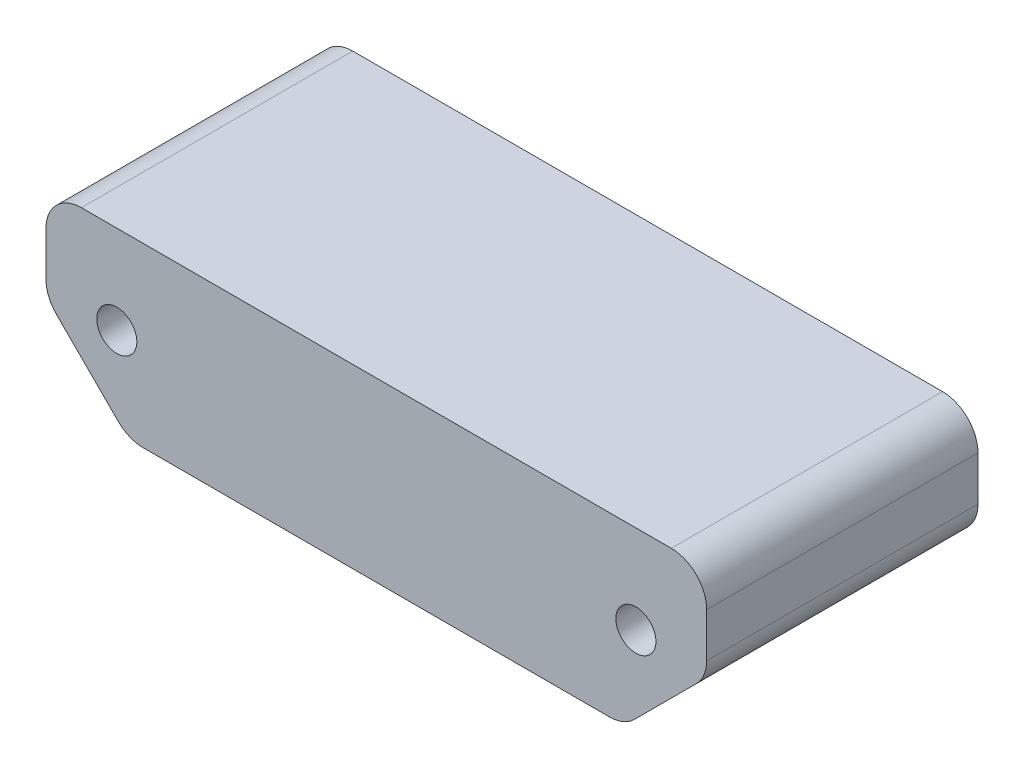
ISO-10303-21;
HEADER;
FILE_DESCRIPTION(('STEP AP214'),'2;1');
FILE_NAME('part.step','',(''),(''),'','','');
FILE_SCHEMA(('AUTOMOTIVE_DESIGN { 1 0 10303 214 1 1 1 1 }'));
ENDSEC;
DATA;
#1=APPLICATION_CONTEXT('core data for automotive mechanical design processes');
#2=APPLICATION_PROTOCOL_DEFINITION('international standard','automotive_design',2000,#1);
#3=PRODUCT_CONTEXT('',#1,'mechanical');
#4=PRODUCT('Part','Part','',(#3));
#5=PRODUCT_RELATED_PRODUCT_CATEGORY('part','',(#4));
#6=PRODUCT_DEFINITION_FORMATION('','',#4);
#7=PRODUCT_DEFINITION_CONTEXT('part definition',#1,'design');
#8=PRODUCT_DEFINITION('design','',#6,#7);
#9=PRODUCT_DEFINITION_SHAPE('','',#8);
#10=(LENGTH_UNIT() NAMED_UNIT(*) SI_UNIT(.MILLI.,.METRE.));
#11=(NAMED_UNIT(*) PLANE_ANGLE_UNIT() SI_UNIT($,.RADIAN.));
#12=(NAMED_UNIT(*) SI_UNIT($,.STERADIAN.) SOLID_ANGLE_UNIT());
#13=UNCERTAINTY_MEASURE_WITH_UNIT(LENGTH_MEASURE(1.E-05),#10,'distance_accuracy_value','');
#14=(GEOMETRIC_REPRESENTATION_CONTEXT(3) GLOBAL_UNCERTAINTY_ASSIGNED_CONTEXT((#13)) GLOBAL_UNIT_ASSIGNED_CONTEXT((#10,
#11,#12)) REPRESENTATION_CONTEXT('',''));
#15=CARTESIAN_POINT('',(0.,0.,0.));
#16=DIRECTION('',(0.,0.,1.));
#17=DIRECTION('',(1.,0.,0.));
#18=AXIS2_PLACEMENT_3D('',#15,#16,#17);
#19=CARTESIAN_POINT('',(0.,0.,23.));
#20=DIRECTION('',(0.,0.,-1.));
#21=DIRECTION('',(-1.,0.,0.));
#22=AXIS2_PLACEMENT_3D('',#19,#20,#21);
#23=PLANE('',#22);
#24=DIRECTION('',(1.,0.,0.));
#25=VECTOR('',#24,1.);
#26=CARTESIAN_POINT('',(-28.,-7.49999999999999,23.));
#27=LINE('',#26,#25);
#28=CARTESIAN_POINT('',(-19.7573593128807,-7.49999999999999,23.));
#29=VERTEX_POINT('',#28);
#30=CARTESIAN_POINT('',(19.7573593128807,-7.49999999999999,23.));
#31=VERTEX_POINT('',#30);
#32=EDGE_CURVE('E152',#29,#31,#27,.T.);
#33=ORIENTED_EDGE('',*,*,#32,.T.);
#34=CARTESIAN_POINT('',(19.7573593128807,-4.49999999999999,23.));
#35=DIRECTION('',(0.,0.,-1.));
#36=DIRECTION('',(-1.,0.,0.));
#37=AXIS2_PLACEMENT_3D('',#34,#35,#36);
#38=CIRCLE('',#37,3.);
#39=CARTESIAN_POINT('',(21.8786796564403,-6.62132034355964,23.));
#40=VERTEX_POINT('',#39);
#41=EDGE_CURVE('E192',#31,#40,#38,.F.);
#42=ORIENTED_EDGE('',*,*,#41,.T.);
#43=DIRECTION('',(-0.707106781186549,-0.707106781186546,0.));
#44=VECTOR('',#43,1.);
#45=CARTESIAN_POINT('',(28.,-0.5,23.));
#46=LINE('',#45,#44);
#47=CARTESIAN_POINT('',(27.1213203435596,-1.37867965644036,23.));
#48=VERTEX_POINT('',#47);
#49=EDGE_CURVE('E154',#40,#48,#46,.F.);
#50=ORIENTED_EDGE('',*,*,#49,.T.);
#51=CARTESIAN_POINT('',(25.,0.742640687119288,23.));
#52=DIRECTION('',(0.,0.,-1.));
#53=DIRECTION('',(-1.,0.,0.));
#54=AXIS2_PLACEMENT_3D('',#51,#52,#53);
#55=CIRCLE('',#54,3.);
#56=CARTESIAN_POINT('',(28.,0.74264068711929,23.));
#57=VERTEX_POINT('',#56);
#58=EDGE_CURVE('E190',#48,#57,#55,.F.);
#59=ORIENTED_EDGE('',*,*,#58,.T.);
#60=DIRECTION('',(0.,1.,0.));
#61=VECTOR('',#60,1.);
#62=CARTESIAN_POINT('',(28.,-7.49999999999999,23.));
#63=LINE('',#62,#61);
#64=CARTESIAN_POINT('',(28.,4.50000000000001,23.));
#65=VERTEX_POINT('',#64);
#66=EDGE_CURVE('E161',#57,#65,#63,.T.);
#67=ORIENTED_EDGE('',*,*,#66,.T.);
#68=CARTESIAN_POINT('',(25.,4.50000000000001,23.));
#69=DIRECTION('',(0.,0.,-1.));
#70=DIRECTION('',(-1.,0.,0.));
#71=AXIS2_PLACEMENT_3D('',#68,#69,#70);
#72=CIRCLE('',#71,3.);
#73=CARTESIAN_POINT('',(25.,7.50000000000001,23.));
#74=VERTEX_POINT('',#73);
#75=EDGE_CURVE('E188',#65,#74,#72,.F.);
#76=ORIENTED_EDGE('',*,*,#75,.T.);
#77=DIRECTION('',(-1.,0.,0.));
#78=VECTOR('',#77,1.);
#79=CARTESIAN_POINT('',(-28.,7.49999999999999,23.));
#80=LINE('',#79,#78);
#81=CARTESIAN_POINT('',(-25.,7.49999999999999,23.));
#82=VERTEX_POINT('',#81);
#83=EDGE_CURVE('E165',#74,#82,#80,.T.);
#84=ORIENTED_EDGE('',*,*,#83,.T.);
#85=CARTESIAN_POINT('',(-25.,4.49999999999999,23.));
#86=DIRECTION('',(0.,0.,-1.));
#87=DIRECTION('',(-1.,0.,0.));
#88=AXIS2_PLACEMENT_3D('',#85,#86,#87);
#89=CIRCLE('',#88,3.);
#90=CARTESIAN_POINT('',(-28.,4.49999999999999,23.));
#91=VERTEX_POINT('',#90);
#92=EDGE_CURVE('E186',#82,#91,#89,.F.);
#93=ORIENTED_EDGE('',*,*,#92,.T.);
#94=DIRECTION('',(0.,-1.,0.));
#95=VECTOR('',#94,1.);
#96=CARTESIAN_POINT('',(-28.,-7.49999999999999,23.));
#97=LINE('',#96,#95);
#98=CARTESIAN_POINT('',(-28.,0.742640687119316,23.));
#99=VERTEX_POINT('',#98);
#100=EDGE_CURVE('E229',#91,#99,#97,.T.);
#101=ORIENTED_EDGE('',*,*,#100,.T.);
#102=CARTESIAN_POINT('',(-25.,0.742640687119316,23.));
#103=DIRECTION('',(0.,0.,-1.));
#104=DIRECTION('',(-1.,0.,0.));
#105=AXIS2_PLACEMENT_3D('',#102,#103,#104);
#106=CIRCLE('',#105,3.);
#107=CARTESIAN_POINT('',(-27.1213203435596,-1.37867965644032,23.));
#108=VERTEX_POINT('',#107);
#109=EDGE_CURVE('E182',#99,#108,#106,.F.);
#110=ORIENTED_EDGE('',*,*,#109,.T.);
#111=DIRECTION('',(-0.707106781186546,0.707106781186549,0.));
#112=VECTOR('',#111,1.);
#113=CARTESIAN_POINT('',(-21.,-7.49999999999999,23.));
#114=LINE('',#113,#112);
#115=CARTESIAN_POINT('',(-21.8786796564404,-6.62132034355963,23.));
#116=VERTEX_POINT('',#115);
#117=EDGE_CURVE('E176',#108,#116,#114,.F.);
#118=ORIENTED_EDGE('',*,*,#117,.T.);
#119=CARTESIAN_POINT('',(-19.7573593128807,-4.49999999999999,23.));
#120=DIRECTION('',(0.,0.,-1.));
#121=DIRECTION('',(-1.,0.,0.));
#122=AXIS2_PLACEMENT_3D('',#119,#120,#121);
#123=CIRCLE('',#122,3.);
#124=EDGE_CURVE('E184',#116,#29,#123,.F.);
#125=ORIENTED_EDGE('',*,*,#124,.T.);
#126=EDGE_LOOP('',(#33,#42,#50,#59,#67,#76,#84,#93,#101,#110,#118,#125));
#127=FACE_BOUND('',#126,.T.);
#128=CARTESIAN_POINT('',(22.,0.,23.));
#129=DIRECTION('',(0.,0.,1.));
#130=DIRECTION('',(1.,0.,0.));
#131=AXIS2_PLACEMENT_3D('',#128,#129,#130);
#132=CIRCLE('',#131,1.7);
#133=CARTESIAN_POINT('',(23.7,0.,23.));
#134=VERTEX_POINT('',#133);
#135=EDGE_CURVE('E241',#134,#134,#132,.T.);
#136=ORIENTED_EDGE('',*,*,#135,.F.);
#137=EDGE_LOOP('',(#136));
#138=FACE_BOUND('',#137,.T.);
#139=CARTESIAN_POINT('',(-22.,0.,23.));
#140=DIRECTION('',(0.,0.,1.));
#141=DIRECTION('',(1.,0.,0.));
#142=AXIS2_PLACEMENT_3D('',#139,#140,#141);
#143=CIRCLE('',#142,1.7);
#144=CARTESIAN_POINT('',(-20.3,0.,23.));
#145=VERTEX_POINT('',#144);
#146=EDGE_CURVE('E409',#145,#145,#143,.T.);
#147=ORIENTED_EDGE('',*,*,#146,.F.);
#148=EDGE_LOOP('',(#147));
#149=FACE_BOUND('',#148,.T.);
#150=ADVANCED_FACE('F44',(#127,#138,#149),#23,.F.);
#151=CARTESIAN_POINT('',(0.,0.,0.));
#152=DIRECTION('',(0.,0.,-1.));
#153=DIRECTION('',(-1.,0.,0.));
#154=AXIS2_PLACEMENT_3D('',#151,#152,#153);
#155=PLANE('',#154);
#156=CARTESIAN_POINT('',(22.,0.,0.));
#157=DIRECTION('',(0.,0.,1.));
#158=DIRECTION('',(1.,0.,0.));
#159=AXIS2_PLACEMENT_3D('',#156,#157,#158);
#160=CIRCLE('',#159,1.7);
#161=CARTESIAN_POINT('',(23.7,0.,0.));
#162=VERTEX_POINT('',#161);
#163=EDGE_CURVE('E408',#162,#162,#160,.T.);
#164=ORIENTED_EDGE('',*,*,#163,.T.);
#165=EDGE_LOOP('',(#164));
#166=FACE_BOUND('',#165,.T.);
#167=DIRECTION('',(0.707106781186549,0.707106781186546,0.));
#168=VECTOR('',#167,1.);
#169=CARTESIAN_POINT('',(14.25,-14.25,0.));
#170=LINE('',#169,#168);
#171=CARTESIAN_POINT('',(27.1213203435596,-1.37867965644036,0.));
#172=VERTEX_POINT('',#171);
#173=CARTESIAN_POINT('',(21.8786796564403,-6.62132034355964,0.));
#174=VERTEX_POINT('',#173);
#175=EDGE_CURVE('E174',#172,#174,#170,.F.);
#176=ORIENTED_EDGE('',*,*,#175,.T.);
#177=CARTESIAN_POINT('',(19.7573593128807,-4.49999999999999,0.));
#178=DIRECTION('',(0.,0.,-1.));
#179=DIRECTION('',(-1.,0.,0.));
#180=AXIS2_PLACEMENT_3D('',#177,#178,#179);
#181=CIRCLE('',#180,3.);
#182=CARTESIAN_POINT('',(19.7573593128807,-7.49999999999999,0.));
#183=VERTEX_POINT('',#182);
#184=EDGE_CURVE('E160',#174,#183,#181,.T.);
#185=ORIENTED_EDGE('',*,*,#184,.T.);
#186=DIRECTION('',(1.,0.,0.));
#187=VECTOR('',#186,1.);
#188=CARTESIAN_POINT('',(-28.,-7.49999999999999,0.));
#189=LINE('',#188,#187);
#190=CARTESIAN_POINT('',(-19.7573593128807,-7.49999999999999,0.));
#191=VERTEX_POINT('',#190);
#192=EDGE_CURVE('E149',#191,#183,#189,.T.);
#193=ORIENTED_EDGE('',*,*,#192,.F.);
#194=CARTESIAN_POINT('',(-19.7573593128807,-4.49999999999999,0.));
#195=DIRECTION('',(0.,0.,-1.));
#196=DIRECTION('',(-1.,0.,0.));
#197=AXIS2_PLACEMENT_3D('',#194,#195,#196);
#198=CIRCLE('',#197,3.);
#199=CARTESIAN_POINT('',(-21.8786796564404,-6.62132034355963,0.));
#200=VERTEX_POINT('',#199);
#201=EDGE_CURVE('E134',#191,#200,#198,.T.);
#202=ORIENTED_EDGE('',*,*,#201,.T.);
#203=DIRECTION('',(0.707106781186546,-0.707106781186549,0.));
#204=VECTOR('',#203,1.);
#205=CARTESIAN_POINT('',(-14.25,-14.25,0.));
#206=LINE('',#205,#204);
#207=CARTESIAN_POINT('',(-27.1213203435596,-1.37867965644032,0.));
#208=VERTEX_POINT('',#207);
#209=EDGE_CURVE('E172',#200,#208,#206,.F.);
#210=ORIENTED_EDGE('',*,*,#209,.T.);
#211=CARTESIAN_POINT('',(-25.,0.742640687119316,0.));
#212=DIRECTION('',(0.,0.,-1.));
#213=DIRECTION('',(-1.,0.,0.));
#214=AXIS2_PLACEMENT_3D('',#211,#212,#213);
#215=CIRCLE('',#214,3.);
#216=CARTESIAN_POINT('',(-28.,0.742640687119316,0.));
#217=VERTEX_POINT('',#216);
#218=EDGE_CURVE('E142',#208,#217,#215,.T.);
#219=ORIENTED_EDGE('',*,*,#218,.T.);
#220=DIRECTION('',(0.,-1.,0.));
#221=VECTOR('',#220,1.);
#222=CARTESIAN_POINT('',(-28.,-7.49999999999999,0.));
#223=LINE('',#222,#221);
#224=CARTESIAN_POINT('',(-28.,4.49999999999999,0.));
#225=VERTEX_POINT('',#224);
#226=EDGE_CURVE('E162',#225,#217,#223,.T.);
#227=ORIENTED_EDGE('',*,*,#226,.F.);
#228=CARTESIAN_POINT('',(-25.,4.49999999999999,0.));
#229=DIRECTION('',(0.,0.,-1.));
#230=DIRECTION('',(-1.,0.,0.));
#231=AXIS2_PLACEMENT_3D('',#228,#229,#230);
#232=CIRCLE('',#231,3.);
#233=CARTESIAN_POINT('',(-25.,7.49999999999999,0.));
#234=VERTEX_POINT('',#233);
#235=EDGE_CURVE('E59',#225,#234,#232,.T.);
#236=ORIENTED_EDGE('',*,*,#235,.T.);
#237=DIRECTION('',(-1.,0.,0.));
#238=VECTOR('',#237,1.);
#239=CARTESIAN_POINT('',(-28.,7.49999999999999,0.));
#240=LINE('',#239,#238);
#241=CARTESIAN_POINT('',(25.,7.50000000000001,0.));
#242=VERTEX_POINT('',#241);
#243=EDGE_CURVE('E168',#242,#234,#240,.T.);
#244=ORIENTED_EDGE('',*,*,#243,.F.);
#245=CARTESIAN_POINT('',(25.,4.50000000000001,0.));
#246=DIRECTION('',(0.,0.,-1.));
#247=DIRECTION('',(-1.,0.,0.));
#248=AXIS2_PLACEMENT_3D('',#245,#246,#247);
#249=CIRCLE('',#248,3.);
#250=CARTESIAN_POINT('',(28.,4.50000000000001,0.));
#251=VERTEX_POINT('',#250);
#252=EDGE_CURVE('E67',#242,#251,#249,.T.);
#253=ORIENTED_EDGE('',*,*,#252,.T.);
#254=DIRECTION('',(0.,1.,0.));
#255=VECTOR('',#254,1.);
#256=CARTESIAN_POINT('',(28.,-7.49999999999999,0.));
#257=LINE('',#256,#255);
#258=CARTESIAN_POINT('',(28.,0.74264068711929,0.));
#259=VERTEX_POINT('',#258);
#260=EDGE_CURVE('E239',#259,#251,#257,.T.);
#261=ORIENTED_EDGE('',*,*,#260,.F.);
#262=CARTESIAN_POINT('',(25.,0.742640687119288,0.));
#263=DIRECTION('',(0.,0.,-1.));
#264=DIRECTION('',(-1.,0.,0.));
#265=AXIS2_PLACEMENT_3D('',#262,#263,#264);
#266=CIRCLE('',#265,3.);
#267=EDGE_CURVE('E201',#259,#172,#266,.T.);
#268=ORIENTED_EDGE('',*,*,#267,.T.);
#269=EDGE_LOOP('',(#176,#185,#193,#202,#210,#219,#227,#236,#244,#253,#261,#268));
#270=FACE_BOUND('',#269,.T.);
#271=CARTESIAN_POINT('',(-22.,0.,0.));
#272=DIRECTION('',(0.,0.,1.));
#273=DIRECTION('',(1.,0.,0.));
#274=AXIS2_PLACEMENT_3D('',#271,#272,#273);
#275=CIRCLE('',#274,1.7);
#276=CARTESIAN_POINT('',(-20.3,0.,0.));
#277=VERTEX_POINT('',#276);
#278=EDGE_CURVE('E413',#277,#277,#275,.T.);
#279=ORIENTED_EDGE('',*,*,#278,.T.);
#280=EDGE_LOOP('',(#279));
#281=FACE_BOUND('',#280,.T.);
#282=ADVANCED_FACE('F157',(#166,#270,#281),#155,.T.);
#283=CARTESIAN_POINT('',(28.,-7.49999999999999,23.));
#284=DIRECTION('',(-1.,0.,0.));
#285=DIRECTION('',(0.,-1.,0.));
#286=AXIS2_PLACEMENT_3D('',#283,#284,#285);
#287=PLANE('',#286);
#288=ORIENTED_EDGE('',*,*,#66,.F.);
#289=DIRECTION('',(0.,0.,1.));
#290=VECTOR('',#289,1.);
#291=CARTESIAN_POINT('',(28.,0.742640687119289,0.));
#292=LINE('',#291,#290);
#293=EDGE_CURVE('E206',#57,#259,#292,.F.);
#294=ORIENTED_EDGE('',*,*,#293,.T.);
#295=ORIENTED_EDGE('',*,*,#260,.T.);
#296=DIRECTION('',(0.,0.,-1.));
#297=VECTOR('',#296,1.);
#298=CARTESIAN_POINT('',(28.,4.50000000000001,23.));
#299=LINE('',#298,#297);
#300=EDGE_CURVE('E204',#251,#65,#299,.F.);
#301=ORIENTED_EDGE('',*,*,#300,.T.);
#302=EDGE_LOOP('',(#288,#294,#295,#301));
#303=FACE_BOUND('',#302,.T.);
#304=ADVANCED_FACE('F263',(#303),#287,.F.);
#305=CARTESIAN_POINT('',(-28.,7.49999999999999,23.));
#306=DIRECTION('',(0.,-1.,0.));
#307=DIRECTION('',(1.,0.,0.));
#308=AXIS2_PLACEMENT_3D('',#305,#306,#307);
#309=PLANE('',#308);
#310=ORIENTED_EDGE('',*,*,#83,.F.);
#311=DIRECTION('',(0.,0.,-1.));
#312=VECTOR('',#311,1.);
#313=CARTESIAN_POINT('',(25.,7.50000000000001,23.));
#314=LINE('',#313,#312);
#315=EDGE_CURVE('E211',#74,#242,#314,.T.);
#316=ORIENTED_EDGE('',*,*,#315,.T.);
#317=ORIENTED_EDGE('',*,*,#243,.T.);
#318=DIRECTION('',(0.,0.,-1.));
#319=VECTOR('',#318,1.);
#320=CARTESIAN_POINT('',(-25.,7.49999999999999,23.));
#321=LINE('',#320,#319);
#322=EDGE_CURVE('E209',#234,#82,#321,.F.);
#323=ORIENTED_EDGE('',*,*,#322,.T.);
#324=EDGE_LOOP('',(#310,#316,#317,#323));
#325=FACE_BOUND('',#324,.T.);
#326=ADVANCED_FACE('F245',(#325),#309,.F.);
#327=CARTESIAN_POINT('',(-28.,-7.49999999999999,23.));
#328=DIRECTION('',(1.,0.,0.));
#329=DIRECTION('',(0.,0.,-1.));
#330=AXIS2_PLACEMENT_3D('',#327,#328,#329);
#331=PLANE('',#330);
#332=ORIENTED_EDGE('',*,*,#100,.F.);
#333=DIRECTION('',(0.,0.,-1.));
#334=VECTOR('',#333,1.);
#335=CARTESIAN_POINT('',(-28.,4.49999999999999,23.));
#336=LINE('',#335,#334);
#337=EDGE_CURVE('E216',#91,#225,#336,.T.);
#338=ORIENTED_EDGE('',*,*,#337,.T.);
#339=ORIENTED_EDGE('',*,*,#226,.T.);
#340=DIRECTION('',(0.,0.,-1.));
#341=VECTOR('',#340,1.);
#342=CARTESIAN_POINT('',(-28.,0.742640687119316,23.));
#343=LINE('',#342,#341);
#344=EDGE_CURVE('E213',#217,#99,#343,.F.);
#345=ORIENTED_EDGE('',*,*,#344,.T.);
#346=EDGE_LOOP('',(#332,#338,#339,#345));
#347=FACE_BOUND('',#346,.T.);
#348=ADVANCED_FACE('F228',(#347),#331,.F.);
#349=CARTESIAN_POINT('',(-28.,-7.49999999999999,23.));
#350=DIRECTION('',(0.,1.,0.));
#351=DIRECTION('',(0.,0.,1.));
#352=AXIS2_PLACEMENT_3D('',#349,#350,#351);
#353=PLANE('',#352);
#354=ORIENTED_EDGE('',*,*,#192,.T.);
#355=DIRECTION('',(0.,0.,-1.));
#356=VECTOR('',#355,1.);
#357=CARTESIAN_POINT('',(19.7573593128807,-7.49999999999999,23.));
#358=LINE('',#357,#356);
#359=EDGE_CURVE('E153',#183,#31,#358,.F.);
#360=ORIENTED_EDGE('',*,*,#359,.T.);
#361=ORIENTED_EDGE('',*,*,#32,.F.);
#362=DIRECTION('',(0.,0.,1.));
#363=VECTOR('',#362,1.);
#364=CARTESIAN_POINT('',(-19.7573593128807,-7.49999999999999,0.));
#365=LINE('',#364,#363);
#366=EDGE_CURVE('E138',#29,#191,#365,.F.);
#367=ORIENTED_EDGE('',*,*,#366,.T.);
#368=EDGE_LOOP('',(#354,#360,#361,#367));
#369=FACE_BOUND('',#368,.T.);
#370=ADVANCED_FACE('F147',(#369),#353,.F.);
#371=CARTESIAN_POINT('',(22.,0.,23.));
#372=DIRECTION('',(0.,0.,-1.));
#373=DIRECTION('',(-1.,0.,0.));
#374=AXIS2_PLACEMENT_3D('',#371,#372,#373);
#375=CYLINDRICAL_SURFACE('',#374,1.7);
#376=ORIENTED_EDGE('',*,*,#135,.T.);
#377=EDGE_LOOP('',(#376));
#378=FACE_BOUND('',#377,.T.);
#379=ORIENTED_EDGE('',*,*,#163,.F.);
#380=EDGE_LOOP('',(#379));
#381=FACE_BOUND('',#380,.T.);
#382=ADVANCED_FACE('F267',(#378,#381),#375,.F.);
#383=CARTESIAN_POINT('',(-22.,0.,23.));
#384=DIRECTION('',(0.,0.,-1.));
#385=DIRECTION('',(-1.,0.,0.));
#386=AXIS2_PLACEMENT_3D('',#383,#384,#385);
#387=CYLINDRICAL_SURFACE('',#386,1.7);
#388=ORIENTED_EDGE('',*,*,#146,.T.);
#389=EDGE_LOOP('',(#388));
#390=FACE_BOUND('',#389,.T.);
#391=ORIENTED_EDGE('',*,*,#278,.F.);
#392=EDGE_LOOP('',(#391));
#393=FACE_BOUND('',#392,.T.);
#394=ADVANCED_FACE('F286',(#390,#393),#387,.F.);
#395=CARTESIAN_POINT('',(28.,-0.5,23.));
#396=DIRECTION('',(-0.707106781186546,0.707106781186549,0.));
#397=DIRECTION('',(0.,0.,-1.));
#398=AXIS2_PLACEMENT_3D('',#395,#396,#397);
#399=PLANE('',#398);
#400=ORIENTED_EDGE('',*,*,#49,.F.);
#401=DIRECTION('',(0.,0.,1.));
#402=VECTOR('',#401,1.);
#403=CARTESIAN_POINT('',(21.8786796564403,-6.62132034355964,0.));
#404=LINE('',#403,#402);
#405=EDGE_CURVE('E196',#40,#174,#404,.F.);
#406=ORIENTED_EDGE('',*,*,#405,.T.);
#407=ORIENTED_EDGE('',*,*,#175,.F.);
#408=DIRECTION('',(0.,0.,-1.));
#409=VECTOR('',#408,1.);
#410=CARTESIAN_POINT('',(27.1213203435596,-1.37867965644036,23.));
#411=LINE('',#410,#409);
#412=EDGE_CURVE('E194',#172,#48,#411,.F.);
#413=ORIENTED_EDGE('',*,*,#412,.T.);
#414=EDGE_LOOP('',(#400,#406,#407,#413));
#415=FACE_BOUND('',#414,.T.);
#416=ADVANCED_FACE('F280',(#415),#399,.F.);
#417=CARTESIAN_POINT('',(-21.,-7.49999999999999,23.));
#418=DIRECTION('',(0.707106781186549,0.707106781186546,0.));
#419=DIRECTION('',(0.,0.,-1.));
#420=AXIS2_PLACEMENT_3D('',#417,#418,#419);
#421=PLANE('',#420);
#422=ORIENTED_EDGE('',*,*,#209,.F.);
#423=DIRECTION('',(0.,0.,-1.));
#424=VECTOR('',#423,1.);
#425=CARTESIAN_POINT('',(-21.8786796564404,-6.62132034355963,23.));
#426=LINE('',#425,#424);
#427=EDGE_CURVE('E11',#200,#116,#426,.F.);
#428=ORIENTED_EDGE('',*,*,#427,.T.);
#429=ORIENTED_EDGE('',*,*,#117,.F.);
#430=DIRECTION('',(0.,0.,1.));
#431=VECTOR('',#430,1.);
#432=CARTESIAN_POINT('',(-27.1213203435596,-1.37867965644032,0.));
#433=LINE('',#432,#431);
#434=EDGE_CURVE('E52',#108,#208,#433,.F.);
#435=ORIENTED_EDGE('',*,*,#434,.T.);
#436=EDGE_LOOP('',(#422,#428,#429,#435));
#437=FACE_BOUND('',#436,.T.);
#438=ADVANCED_FACE('F221',(#437),#421,.F.);
#439=CARTESIAN_POINT('',(19.7573593128807,-4.49999999999999,23.));
#440=DIRECTION('',(0.,0.,1.));
#441=DIRECTION('',(1.,0.,0.));
#442=AXIS2_PLACEMENT_3D('',#439,#440,#441);
#443=CYLINDRICAL_SURFACE('',#442,3.);
#444=ORIENTED_EDGE('',*,*,#184,.F.);
#445=ORIENTED_EDGE('',*,*,#405,.F.);
#446=ORIENTED_EDGE('',*,*,#41,.F.);
#447=ORIENTED_EDGE('',*,*,#359,.F.);
#448=EDGE_LOOP('',(#444,#445,#446,#447));
#449=FACE_BOUND('',#448,.T.);
#450=ADVANCED_FACE('F292',(#449),#443,.T.);
#451=CARTESIAN_POINT('',(25.,0.742640687119288,23.));
#452=DIRECTION('',(0.,0.,-1.));
#453=DIRECTION('',(-1.,0.,0.));
#454=AXIS2_PLACEMENT_3D('',#451,#452,#453);
#455=CYLINDRICAL_SURFACE('',#454,3.);
#456=ORIENTED_EDGE('',*,*,#58,.F.);
#457=ORIENTED_EDGE('',*,*,#412,.F.);
#458=ORIENTED_EDGE('',*,*,#267,.F.);
#459=ORIENTED_EDGE('',*,*,#293,.F.);
#460=EDGE_LOOP('',(#456,#457,#458,#459));
#461=FACE_BOUND('',#460,.T.);
#462=ADVANCED_FACE('F255',(#461),#455,.T.);
#463=CARTESIAN_POINT('',(25.,4.50000000000001,23.));
#464=DIRECTION('',(0.,0.,-1.));
#465=DIRECTION('',(-1.,0.,0.));
#466=AXIS2_PLACEMENT_3D('',#463,#464,#465);
#467=CYLINDRICAL_SURFACE('',#466,3.);
#468=ORIENTED_EDGE('',*,*,#75,.F.);
#469=ORIENTED_EDGE('',*,*,#300,.F.);
#470=ORIENTED_EDGE('',*,*,#252,.F.);
#471=ORIENTED_EDGE('',*,*,#315,.F.);
#472=EDGE_LOOP('',(#468,#469,#470,#471));
#473=FACE_BOUND('',#472,.T.);
#474=ADVANCED_FACE('F249',(#473),#467,.T.);
#475=CARTESIAN_POINT('',(-25.,4.49999999999999,23.));
#476=DIRECTION('',(0.,0.,-1.));
#477=DIRECTION('',(-1.,0.,0.));
#478=AXIS2_PLACEMENT_3D('',#475,#476,#477);
#479=CYLINDRICAL_SURFACE('',#478,3.);
#480=ORIENTED_EDGE('',*,*,#92,.F.);
#481=ORIENTED_EDGE('',*,*,#322,.F.);
#482=ORIENTED_EDGE('',*,*,#235,.F.);
#483=ORIENTED_EDGE('',*,*,#337,.F.);
#484=EDGE_LOOP('',(#480,#481,#482,#483));
#485=FACE_BOUND('',#484,.T.);
#486=ADVANCED_FACE('F247',(#485),#479,.T.);
#487=CARTESIAN_POINT('',(-19.7573593128807,-4.49999999999999,23.));
#488=DIRECTION('',(0.,0.,-1.));
#489=DIRECTION('',(-1.,0.,0.));
#490=AXIS2_PLACEMENT_3D('',#487,#488,#489);
#491=CYLINDRICAL_SURFACE('',#490,3.);
#492=ORIENTED_EDGE('',*,*,#124,.F.);
#493=ORIENTED_EDGE('',*,*,#427,.F.);
#494=ORIENTED_EDGE('',*,*,#201,.F.);
#495=ORIENTED_EDGE('',*,*,#366,.F.);
#496=EDGE_LOOP('',(#492,#493,#494,#495));
#497=FACE_BOUND('',#496,.T.);
#498=ADVANCED_FACE('F137',(#497),#491,.T.);
#499=CARTESIAN_POINT('',(-25.,0.742640687119316,23.));
#500=DIRECTION('',(0.,0.,1.));
#501=DIRECTION('',(1.,0.,0.));
#502=AXIS2_PLACEMENT_3D('',#499,#500,#501);
#503=CYLINDRICAL_SURFACE('',#502,3.);
#504=ORIENTED_EDGE('',*,*,#218,.F.);
#505=ORIENTED_EDGE('',*,*,#434,.F.);
#506=ORIENTED_EDGE('',*,*,#109,.F.);
#507=ORIENTED_EDGE('',*,*,#344,.F.);
#508=EDGE_LOOP('',(#504,#505,#506,#507));
#509=FACE_BOUND('',#508,.T.);
#510=ADVANCED_FACE('F46',(#509),#503,.T.);
#511=CLOSED_SHELL('',(#150,#282,#304,#326,#348,#370,#382,#394,#416,#438,#450,#462,#474,#486,
#498,#510));
#512=MANIFOLD_SOLID_BREP('B2',#511);
#513=ADVANCED_BREP_SHAPE_REPRESENTATION('',(#18,#512),#14);
#514=SHAPE_DEFINITION_REPRESENTATION(#9,#513);
ENDSEC;
END-ISO-10303-21;
